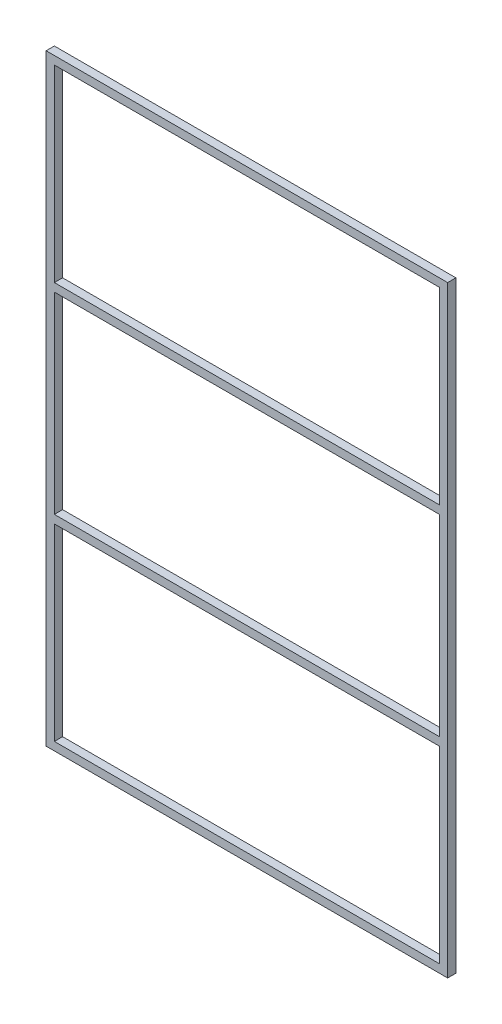
ISO-10303-21;
HEADER;
FILE_DESCRIPTION(('STEP AP214'),'2;1');
FILE_NAME('part.step','',(''),(''),'','','');
FILE_SCHEMA(('AUTOMOTIVE_DESIGN { 1 0 10303 214 1 1 1 1 }'));
ENDSEC;
DATA;
#1=APPLICATION_CONTEXT('core data for automotive mechanical design processes');
#2=APPLICATION_PROTOCOL_DEFINITION('international standard','automotive_design',2000,#1);
#3=PRODUCT_CONTEXT('',#1,'mechanical');
#4=PRODUCT('Part','Part','',(#3));
#5=PRODUCT_RELATED_PRODUCT_CATEGORY('part','',(#4));
#6=PRODUCT_DEFINITION_FORMATION('','',#4);
#7=PRODUCT_DEFINITION_CONTEXT('part definition',#1,'design');
#8=PRODUCT_DEFINITION('design','',#6,#7);
#9=PRODUCT_DEFINITION_SHAPE('','',#8);
#10=(LENGTH_UNIT() NAMED_UNIT(*) SI_UNIT(.MILLI.,.METRE.));
#11=(NAMED_UNIT(*) PLANE_ANGLE_UNIT() SI_UNIT($,.RADIAN.));
#12=(NAMED_UNIT(*) SI_UNIT($,.STERADIAN.) SOLID_ANGLE_UNIT());
#13=UNCERTAINTY_MEASURE_WITH_UNIT(LENGTH_MEASURE(1.E-05),#10,'distance_accuracy_value','');
#14=(GEOMETRIC_REPRESENTATION_CONTEXT(3) GLOBAL_UNCERTAINTY_ASSIGNED_CONTEXT((#13)) GLOBAL_UNIT_ASSIGNED_CONTEXT((#10,
#11,#12)) REPRESENTATION_CONTEXT('',''));
#15=CARTESIAN_POINT('',(0.,0.,0.));
#16=DIRECTION('',(0.,0.,1.));
#17=DIRECTION('',(1.,0.,0.));
#18=AXIS2_PLACEMENT_3D('',#15,#16,#17);
#19=CARTESIAN_POINT('',(0.,0.,50.));
#20=DIRECTION('',(0.,0.,1.));
#21=DIRECTION('',(1.,0.,0.));
#22=AXIS2_PLACEMENT_3D('',#19,#20,#21);
#23=PLANE('',#22);
#24=DIRECTION('',(0.,-1.,0.));
#25=VECTOR('',#24,1.);
#26=CARTESIAN_POINT('',(-1447.83132530121,1201.6265060241,50.));
#27=LINE('',#26,#25);
#28=CARTESIAN_POINT('',(-1447.83132530121,1201.6265060241,50.));
#29=VERTEX_POINT('',#28);
#30=CARTESIAN_POINT('',(-1447.8313253012,-2458.3734939759,50.));
#31=VERTEX_POINT('',#30);
#32=EDGE_CURVE('E293',#29,#31,#27,.T.);
#33=ORIENTED_EDGE('',*,*,#32,.T.);
#34=DIRECTION('',(1.,0.,0.));
#35=VECTOR('',#34,1.);
#36=CARTESIAN_POINT('',(-1447.8313253012,-2458.3734939759,50.));
#37=LINE('',#36,#35);
#38=CARTESIAN_POINT('',(992.168674698795,-2458.3734939759,50.));
#39=VERTEX_POINT('',#38);
#40=EDGE_CURVE('E297',#31,#39,#37,.T.);
#41=ORIENTED_EDGE('',*,*,#40,.T.);
#42=DIRECTION('',(0.,1.,0.));
#43=VECTOR('',#42,1.);
#44=CARTESIAN_POINT('',(992.168674698795,1201.6265060241,50.));
#45=LINE('',#44,#43);
#46=CARTESIAN_POINT('',(992.168674698795,1201.6265060241,50.));
#47=VERTEX_POINT('',#46);
#48=EDGE_CURVE('E301',#39,#47,#45,.T.);
#49=ORIENTED_EDGE('',*,*,#48,.T.);
#50=DIRECTION('',(-1.,0.,0.));
#51=VECTOR('',#50,1.);
#52=CARTESIAN_POINT('',(-1447.83132530121,1201.6265060241,50.));
#53=LINE('',#52,#51);
#54=EDGE_CURVE('E304',#47,#29,#53,.T.);
#55=ORIENTED_EDGE('',*,*,#54,.T.);
#56=EDGE_LOOP('',(#33,#41,#49,#55));
#57=FACE_BOUND('',#56,.T.);
#58=DIRECTION('',(1.,0.,0.));
#59=VECTOR('',#58,1.);
#60=CARTESIAN_POINT('',(-1397.83132530121,6.62650602409631,50.));
#61=LINE('',#60,#59);
#62=CARTESIAN_POINT('',(-1397.83132530121,6.62650602409631,50.));
#63=VERTEX_POINT('',#62);
#64=CARTESIAN_POINT('',(942.168674698795,6.62650602409642,50.));
#65=VERTEX_POINT('',#64);
#66=EDGE_CURVE('E253',#63,#65,#61,.T.);
#67=ORIENTED_EDGE('',*,*,#66,.F.);
#68=DIRECTION('',(0.,-1.,0.));
#69=VECTOR('',#68,1.);
#70=CARTESIAN_POINT('',(-1397.83132530121,6.62650602409631,50.));
#71=LINE('',#70,#69);
#72=CARTESIAN_POINT('',(-1397.83132530121,1151.6265060241,50.));
#73=VERTEX_POINT('',#72);
#74=EDGE_CURVE('E250',#73,#63,#71,.T.);
#75=ORIENTED_EDGE('',*,*,#74,.F.);
#76=DIRECTION('',(-1.,0.,0.));
#77=VECTOR('',#76,1.);
#78=CARTESIAN_POINT('',(-1397.83132530121,1151.6265060241,50.));
#79=LINE('',#78,#77);
#80=CARTESIAN_POINT('',(942.168674698794,1151.6265060241,50.));
#81=VERTEX_POINT('',#80);
#82=EDGE_CURVE('E261',#81,#73,#79,.T.);
#83=ORIENTED_EDGE('',*,*,#82,.F.);
#84=DIRECTION('',(0.,1.,0.));
#85=VECTOR('',#84,1.);
#86=CARTESIAN_POINT('',(942.168674698795,6.62650602409642,50.));
#87=LINE('',#86,#85);
#88=EDGE_CURVE('E257',#65,#81,#87,.T.);
#89=ORIENTED_EDGE('',*,*,#88,.F.);
#90=EDGE_LOOP('',(#67,#75,#83,#89));
#91=FACE_BOUND('',#90,.T.);
#92=DIRECTION('',(1.,0.,0.));
#93=VECTOR('',#92,1.);
#94=CARTESIAN_POINT('',(-1397.83132530121,-2408.3734939759,50.));
#95=LINE('',#94,#93);
#96=CARTESIAN_POINT('',(-1397.83132530121,-2408.3734939759,50.));
#97=VERTEX_POINT('',#96);
#98=CARTESIAN_POINT('',(942.168674698795,-2408.3734939759,50.));
#99=VERTEX_POINT('',#98);
#100=EDGE_CURVE('E210',#97,#99,#95,.T.);
#101=ORIENTED_EDGE('',*,*,#100,.F.);
#102=DIRECTION('',(0.,-1.,0.));
#103=VECTOR('',#102,1.);
#104=CARTESIAN_POINT('',(-1397.83132530121,-1263.3734939759,50.));
#105=LINE('',#104,#103);
#106=CARTESIAN_POINT('',(-1397.83132530121,-1263.3734939759,50.));
#107=VERTEX_POINT('',#106);
#108=EDGE_CURVE('E207',#107,#97,#105,.T.);
#109=ORIENTED_EDGE('',*,*,#108,.F.);
#110=DIRECTION('',(-1.,0.,0.));
#111=VECTOR('',#110,1.);
#112=CARTESIAN_POINT('',(-1397.83132530121,-1263.3734939759,50.));
#113=LINE('',#112,#111);
#114=CARTESIAN_POINT('',(942.168674698795,-1263.3734939759,50.));
#115=VERTEX_POINT('',#114);
#116=EDGE_CURVE('E218',#115,#107,#113,.T.);
#117=ORIENTED_EDGE('',*,*,#116,.F.);
#118=DIRECTION('',(0.,1.,0.));
#119=VECTOR('',#118,1.);
#120=CARTESIAN_POINT('',(942.168674698795,-1263.3734939759,50.));
#121=LINE('',#120,#119);
#122=EDGE_CURVE('E214',#99,#115,#121,.T.);
#123=ORIENTED_EDGE('',*,*,#122,.F.);
#124=EDGE_LOOP('',(#101,#109,#117,#123));
#125=FACE_BOUND('',#124,.T.);
#126=DIRECTION('',(1.,0.,0.));
#127=VECTOR('',#126,1.);
#128=CARTESIAN_POINT('',(-1397.83132530121,-1213.3734939759,50.));
#129=LINE('',#128,#127);
#130=CARTESIAN_POINT('',(-1397.83132530121,-1213.3734939759,50.));
#131=VERTEX_POINT('',#130);
#132=CARTESIAN_POINT('',(942.168674698795,-1213.3734939759,50.));
#133=VERTEX_POINT('',#132);
#134=EDGE_CURVE('E168',#131,#133,#129,.T.);
#135=ORIENTED_EDGE('',*,*,#134,.F.);
#136=DIRECTION('',(0.,-1.,0.));
#137=VECTOR('',#136,1.);
#138=CARTESIAN_POINT('',(-1397.83132530121,-43.3734939759036,50.));
#139=LINE('',#138,#137);
#140=CARTESIAN_POINT('',(-1397.83132530121,-43.3734939759036,50.));
#141=VERTEX_POINT('',#140);
#142=EDGE_CURVE('E159',#141,#131,#139,.T.);
#143=ORIENTED_EDGE('',*,*,#142,.F.);
#144=DIRECTION('',(-1.,0.,0.));
#145=VECTOR('',#144,1.);
#146=CARTESIAN_POINT('',(-1397.83132530121,-43.3734939759036,50.));
#147=LINE('',#146,#145);
#148=CARTESIAN_POINT('',(942.168674698795,-43.3734939759036,50.));
#149=VERTEX_POINT('',#148);
#150=EDGE_CURVE('E185',#149,#141,#147,.T.);
#151=ORIENTED_EDGE('',*,*,#150,.F.);
#152=DIRECTION('',(0.,1.,0.));
#153=VECTOR('',#152,1.);
#154=CARTESIAN_POINT('',(942.168674698795,-43.3734939759036,50.));
#155=LINE('',#154,#153);
#156=EDGE_CURVE('E181',#133,#149,#155,.T.);
#157=ORIENTED_EDGE('',*,*,#156,.F.);
#158=EDGE_LOOP('',(#135,#143,#151,#157));
#159=FACE_BOUND('',#158,.T.);
#160=ADVANCED_FACE('F45',(#57,#91,#125,#159),#23,.T.);
#161=CARTESIAN_POINT('',(0.,0.,0.));
#162=DIRECTION('',(0.,0.,1.));
#163=DIRECTION('',(1.,0.,0.));
#164=AXIS2_PLACEMENT_3D('',#161,#162,#163);
#165=PLANE('',#164);
#166=DIRECTION('',(0.,-1.,0.));
#167=VECTOR('',#166,1.);
#168=CARTESIAN_POINT('',(-1397.83132530121,-1263.3734939759,0.));
#169=LINE('',#168,#167);
#170=CARTESIAN_POINT('',(-1397.83132530121,-1263.3734939759,0.));
#171=VERTEX_POINT('',#170);
#172=CARTESIAN_POINT('',(-1397.83132530121,-2408.3734939759,0.));
#173=VERTEX_POINT('',#172);
#174=EDGE_CURVE('E177',#171,#173,#169,.T.);
#175=ORIENTED_EDGE('',*,*,#174,.T.);
#176=DIRECTION('',(1.,0.,0.));
#177=VECTOR('',#176,1.);
#178=CARTESIAN_POINT('',(-1397.83132530121,-2408.3734939759,0.));
#179=LINE('',#178,#177);
#180=CARTESIAN_POINT('',(942.168674698795,-2408.3734939759,0.));
#181=VERTEX_POINT('',#180);
#182=EDGE_CURVE('E225',#173,#181,#179,.T.);
#183=ORIENTED_EDGE('',*,*,#182,.T.);
#184=DIRECTION('',(0.,1.,0.));
#185=VECTOR('',#184,1.);
#186=CARTESIAN_POINT('',(942.168674698795,-1263.3734939759,0.));
#187=LINE('',#186,#185);
#188=CARTESIAN_POINT('',(942.168674698795,-1263.3734939759,0.));
#189=VERTEX_POINT('',#188);
#190=EDGE_CURVE('E229',#181,#189,#187,.T.);
#191=ORIENTED_EDGE('',*,*,#190,.T.);
#192=DIRECTION('',(-1.,0.,0.));
#193=VECTOR('',#192,1.);
#194=CARTESIAN_POINT('',(-1397.83132530121,-1263.3734939759,0.));
#195=LINE('',#194,#193);
#196=EDGE_CURVE('E211',#189,#171,#195,.T.);
#197=ORIENTED_EDGE('',*,*,#196,.T.);
#198=EDGE_LOOP('',(#175,#183,#191,#197));
#199=FACE_BOUND('',#198,.T.);
#200=DIRECTION('',(0.,-1.,0.));
#201=VECTOR('',#200,1.);
#202=CARTESIAN_POINT('',(-1447.83132530121,1201.6265060241,0.));
#203=LINE('',#202,#201);
#204=CARTESIAN_POINT('',(-1447.83132530121,1201.6265060241,0.));
#205=VERTEX_POINT('',#204);
#206=CARTESIAN_POINT('',(-1447.8313253012,-2458.3734939759,0.));
#207=VERTEX_POINT('',#206);
#208=EDGE_CURVE('E292',#205,#207,#203,.T.);
#209=ORIENTED_EDGE('',*,*,#208,.F.);
#210=DIRECTION('',(-1.,0.,0.));
#211=VECTOR('',#210,1.);
#212=CARTESIAN_POINT('',(-1447.83132530121,1201.6265060241,0.));
#213=LINE('',#212,#211);
#214=CARTESIAN_POINT('',(992.168674698795,1201.6265060241,0.));
#215=VERTEX_POINT('',#214);
#216=EDGE_CURVE('E298',#215,#205,#213,.T.);
#217=ORIENTED_EDGE('',*,*,#216,.F.);
#218=DIRECTION('',(0.,1.,0.));
#219=VECTOR('',#218,1.);
#220=CARTESIAN_POINT('',(992.168674698795,1201.6265060241,0.));
#221=LINE('',#220,#219);
#222=CARTESIAN_POINT('',(992.168674698795,-2458.3734939759,0.));
#223=VERTEX_POINT('',#222);
#224=EDGE_CURVE('E314',#223,#215,#221,.T.);
#225=ORIENTED_EDGE('',*,*,#224,.F.);
#226=DIRECTION('',(1.,0.,0.));
#227=VECTOR('',#226,1.);
#228=CARTESIAN_POINT('',(-1447.8313253012,-2458.3734939759,0.));
#229=LINE('',#228,#227);
#230=EDGE_CURVE('E311',#207,#223,#229,.T.);
#231=ORIENTED_EDGE('',*,*,#230,.F.);
#232=EDGE_LOOP('',(#209,#217,#225,#231));
#233=FACE_BOUND('',#232,.T.);
#234=DIRECTION('',(0.,-1.,0.));
#235=VECTOR('',#234,1.);
#236=CARTESIAN_POINT('',(-1397.83132530121,6.62650602409631,0.));
#237=LINE('',#236,#235);
#238=CARTESIAN_POINT('',(-1397.83132530121,1151.6265060241,0.));
#239=VERTEX_POINT('',#238);
#240=CARTESIAN_POINT('',(-1397.83132530121,6.62650602409631,0.));
#241=VERTEX_POINT('',#240);
#242=EDGE_CURVE('E249',#239,#241,#237,.T.);
#243=ORIENTED_EDGE('',*,*,#242,.T.);
#244=DIRECTION('',(1.,0.,0.));
#245=VECTOR('',#244,1.);
#246=CARTESIAN_POINT('',(-1397.83132530121,6.62650602409631,0.));
#247=LINE('',#246,#245);
#248=CARTESIAN_POINT('',(942.168674698795,6.62650602409642,0.));
#249=VERTEX_POINT('',#248);
#250=EDGE_CURVE('E268',#241,#249,#247,.T.);
#251=ORIENTED_EDGE('',*,*,#250,.T.);
#252=DIRECTION('',(0.,1.,0.));
#253=VECTOR('',#252,1.);
#254=CARTESIAN_POINT('',(942.168674698795,6.62650602409642,0.));
#255=LINE('',#254,#253);
#256=CARTESIAN_POINT('',(942.168674698794,1151.6265060241,0.));
#257=VERTEX_POINT('',#256);
#258=EDGE_CURVE('E272',#249,#257,#255,.T.);
#259=ORIENTED_EDGE('',*,*,#258,.T.);
#260=DIRECTION('',(-1.,0.,0.));
#261=VECTOR('',#260,1.);
#262=CARTESIAN_POINT('',(-1397.83132530121,1151.6265060241,0.));
#263=LINE('',#262,#261);
#264=EDGE_CURVE('E254',#257,#239,#263,.T.);
#265=ORIENTED_EDGE('',*,*,#264,.T.);
#266=EDGE_LOOP('',(#243,#251,#259,#265));
#267=FACE_BOUND('',#266,.T.);
#268=DIRECTION('',(0.,-1.,0.));
#269=VECTOR('',#268,1.);
#270=CARTESIAN_POINT('',(-1397.83132530121,-43.3734939759036,0.));
#271=LINE('',#270,#269);
#272=CARTESIAN_POINT('',(-1397.83132530121,-43.3734939759036,0.));
#273=VERTEX_POINT('',#272);
#274=CARTESIAN_POINT('',(-1397.83132530121,-1213.3734939759,0.));
#275=VERTEX_POINT('',#274);
#276=EDGE_CURVE('E69',#273,#275,#271,.T.);
#277=ORIENTED_EDGE('',*,*,#276,.T.);
#278=DIRECTION('',(1.,0.,0.));
#279=VECTOR('',#278,1.);
#280=CARTESIAN_POINT('',(-1397.83132530121,-1213.3734939759,0.));
#281=LINE('',#280,#279);
#282=CARTESIAN_POINT('',(942.168674698795,-1213.3734939759,0.));
#283=VERTEX_POINT('',#282);
#284=EDGE_CURVE('E175',#275,#283,#281,.T.);
#285=ORIENTED_EDGE('',*,*,#284,.T.);
#286=DIRECTION('',(0.,1.,0.));
#287=VECTOR('',#286,1.);
#288=CARTESIAN_POINT('',(942.168674698795,-43.3734939759036,0.));
#289=LINE('',#288,#287);
#290=CARTESIAN_POINT('',(942.168674698795,-43.3734939759036,0.));
#291=VERTEX_POINT('',#290);
#292=EDGE_CURVE('E194',#283,#291,#289,.T.);
#293=ORIENTED_EDGE('',*,*,#292,.T.);
#294=DIRECTION('',(-1.,0.,0.));
#295=VECTOR('',#294,1.);
#296=CARTESIAN_POINT('',(-1397.83132530121,-43.3734939759036,0.));
#297=LINE('',#296,#295);
#298=EDGE_CURVE('E169',#291,#273,#297,.T.);
#299=ORIENTED_EDGE('',*,*,#298,.T.);
#300=EDGE_LOOP('',(#277,#285,#293,#299));
#301=FACE_BOUND('',#300,.T.);
#302=ADVANCED_FACE('F337',(#199,#233,#267,#301),#165,.F.);
#303=CARTESIAN_POINT('',(-1447.83132530121,1201.6265060241,50.));
#304=DIRECTION('',(1.,0.,0.));
#305=DIRECTION('',(0.,1.,0.));
#306=AXIS2_PLACEMENT_3D('',#303,#304,#305);
#307=PLANE('',#306);
#308=ORIENTED_EDGE('',*,*,#208,.T.);
#309=DIRECTION('',(0.,0.,-1.));
#310=VECTOR('',#309,1.);
#311=CARTESIAN_POINT('',(-1447.8313253012,-2458.3734939759,50.));
#312=LINE('',#311,#310);
#313=EDGE_CURVE('E11',#31,#207,#312,.T.);
#314=ORIENTED_EDGE('',*,*,#313,.F.);
#315=ORIENTED_EDGE('',*,*,#32,.F.);
#316=DIRECTION('',(0.,0.,-1.));
#317=VECTOR('',#316,1.);
#318=CARTESIAN_POINT('',(-1447.83132530121,1201.6265060241,50.));
#319=LINE('',#318,#317);
#320=EDGE_CURVE('E307',#29,#205,#319,.T.);
#321=ORIENTED_EDGE('',*,*,#320,.T.);
#322=EDGE_LOOP('',(#308,#314,#315,#321));
#323=FACE_BOUND('',#322,.T.);
#324=ADVANCED_FACE('F47',(#323),#307,.F.);
#325=CARTESIAN_POINT('',(-1447.8313253012,-2458.3734939759,50.));
#326=DIRECTION('',(0.,1.,0.));
#327=DIRECTION('',(0.,0.,1.));
#328=AXIS2_PLACEMENT_3D('',#325,#326,#327);
#329=PLANE('',#328);
#330=ORIENTED_EDGE('',*,*,#230,.T.);
#331=DIRECTION('',(0.,0.,-1.));
#332=VECTOR('',#331,1.);
#333=CARTESIAN_POINT('',(992.168674698795,-2458.3734939759,50.));
#334=LINE('',#333,#332);
#335=EDGE_CURVE('E54',#39,#223,#334,.T.);
#336=ORIENTED_EDGE('',*,*,#335,.F.);
#337=ORIENTED_EDGE('',*,*,#40,.F.);
#338=ORIENTED_EDGE('',*,*,#313,.T.);
#339=EDGE_LOOP('',(#330,#336,#337,#338));
#340=FACE_BOUND('',#339,.T.);
#341=ADVANCED_FACE('F348',(#340),#329,.F.);
#342=CARTESIAN_POINT('',(992.168674698795,1201.6265060241,50.));
#343=DIRECTION('',(-1.,0.,0.));
#344=DIRECTION('',(0.,-1.,0.));
#345=AXIS2_PLACEMENT_3D('',#342,#343,#344);
#346=PLANE('',#345);
#347=ORIENTED_EDGE('',*,*,#224,.T.);
#348=DIRECTION('',(0.,0.,-1.));
#349=VECTOR('',#348,1.);
#350=CARTESIAN_POINT('',(992.168674698795,1201.6265060241,50.));
#351=LINE('',#350,#349);
#352=EDGE_CURVE('E322',#47,#215,#351,.T.);
#353=ORIENTED_EDGE('',*,*,#352,.F.);
#354=ORIENTED_EDGE('',*,*,#48,.F.);
#355=ORIENTED_EDGE('',*,*,#335,.T.);
#356=EDGE_LOOP('',(#347,#353,#354,#355));
#357=FACE_BOUND('',#356,.T.);
#358=ADVANCED_FACE('F331',(#357),#346,.F.);
#359=CARTESIAN_POINT('',(-1447.83132530121,1201.6265060241,50.));
#360=DIRECTION('',(0.,-1.,0.));
#361=DIRECTION('',(0.,0.,-1.));
#362=AXIS2_PLACEMENT_3D('',#359,#360,#361);
#363=PLANE('',#362);
#364=ORIENTED_EDGE('',*,*,#216,.T.);
#365=ORIENTED_EDGE('',*,*,#320,.F.);
#366=ORIENTED_EDGE('',*,*,#54,.F.);
#367=ORIENTED_EDGE('',*,*,#352,.T.);
#368=EDGE_LOOP('',(#364,#365,#366,#367));
#369=FACE_BOUND('',#368,.T.);
#370=ADVANCED_FACE('F341',(#369),#363,.F.);
#371=CARTESIAN_POINT('',(-1397.83132530121,6.62650602409631,50.));
#372=DIRECTION('',(1.,0.,0.));
#373=DIRECTION('',(0.,0.,-1.));
#374=AXIS2_PLACEMENT_3D('',#371,#372,#373);
#375=PLANE('',#374);
#376=ORIENTED_EDGE('',*,*,#242,.F.);
#377=DIRECTION('',(0.,0.,-1.));
#378=VECTOR('',#377,1.);
#379=CARTESIAN_POINT('',(-1397.83132530121,1151.6265060241,50.));
#380=LINE('',#379,#378);
#381=EDGE_CURVE('E264',#73,#239,#380,.T.);
#382=ORIENTED_EDGE('',*,*,#381,.F.);
#383=ORIENTED_EDGE('',*,*,#74,.T.);
#384=DIRECTION('',(0.,0.,-1.));
#385=VECTOR('',#384,1.);
#386=CARTESIAN_POINT('',(-1397.83132530121,6.62650602409631,50.));
#387=LINE('',#386,#385);
#388=EDGE_CURVE('E288',#63,#241,#387,.T.);
#389=ORIENTED_EDGE('',*,*,#388,.T.);
#390=EDGE_LOOP('',(#376,#382,#383,#389));
#391=FACE_BOUND('',#390,.T.);
#392=ADVANCED_FACE('F363',(#391),#375,.T.);
#393=CARTESIAN_POINT('',(-1397.83132530121,6.62650602409631,50.));
#394=DIRECTION('',(0.,1.,0.));
#395=DIRECTION('',(-1.,0.,0.));
#396=AXIS2_PLACEMENT_3D('',#393,#394,#395);
#397=PLANE('',#396);
#398=ORIENTED_EDGE('',*,*,#250,.F.);
#399=ORIENTED_EDGE('',*,*,#388,.F.);
#400=ORIENTED_EDGE('',*,*,#66,.T.);
#401=DIRECTION('',(0.,0.,-1.));
#402=VECTOR('',#401,1.);
#403=CARTESIAN_POINT('',(942.168674698795,6.62650602409642,50.));
#404=LINE('',#403,#402);
#405=EDGE_CURVE('E285',#65,#249,#404,.T.);
#406=ORIENTED_EDGE('',*,*,#405,.T.);
#407=EDGE_LOOP('',(#398,#399,#400,#406));
#408=FACE_BOUND('',#407,.T.);
#409=ADVANCED_FACE('F370',(#408),#397,.T.);
#410=CARTESIAN_POINT('',(942.168674698795,6.62650602409642,50.));
#411=DIRECTION('',(-1.,0.,0.));
#412=DIRECTION('',(0.,-1.,0.));
#413=AXIS2_PLACEMENT_3D('',#410,#411,#412);
#414=PLANE('',#413);
#415=ORIENTED_EDGE('',*,*,#258,.F.);
#416=ORIENTED_EDGE('',*,*,#405,.F.);
#417=ORIENTED_EDGE('',*,*,#88,.T.);
#418=DIRECTION('',(0.,0.,-1.));
#419=VECTOR('',#418,1.);
#420=CARTESIAN_POINT('',(942.168674698794,1151.6265060241,50.));
#421=LINE('',#420,#419);
#422=EDGE_CURVE('E282',#81,#257,#421,.T.);
#423=ORIENTED_EDGE('',*,*,#422,.T.);
#424=EDGE_LOOP('',(#415,#416,#417,#423));
#425=FACE_BOUND('',#424,.T.);
#426=ADVANCED_FACE('F375',(#425),#414,.T.);
#427=CARTESIAN_POINT('',(-1397.83132530121,1151.6265060241,50.));
#428=DIRECTION('',(0.,-1.,0.));
#429=DIRECTION('',(0.,0.,-1.));
#430=AXIS2_PLACEMENT_3D('',#427,#428,#429);
#431=PLANE('',#430);
#432=ORIENTED_EDGE('',*,*,#264,.F.);
#433=ORIENTED_EDGE('',*,*,#422,.F.);
#434=ORIENTED_EDGE('',*,*,#82,.T.);
#435=ORIENTED_EDGE('',*,*,#381,.T.);
#436=EDGE_LOOP('',(#432,#433,#434,#435));
#437=FACE_BOUND('',#436,.T.);
#438=ADVANCED_FACE('F382',(#437),#431,.T.);
#439=CARTESIAN_POINT('',(-1397.83132530121,-1263.3734939759,50.));
#440=DIRECTION('',(1.,0.,0.));
#441=DIRECTION('',(0.,0.,-1.));
#442=AXIS2_PLACEMENT_3D('',#439,#440,#441);
#443=PLANE('',#442);
#444=ORIENTED_EDGE('',*,*,#174,.F.);
#445=DIRECTION('',(0.,0.,-1.));
#446=VECTOR('',#445,1.);
#447=CARTESIAN_POINT('',(-1397.83132530121,-1263.3734939759,50.));
#448=LINE('',#447,#446);
#449=EDGE_CURVE('E221',#107,#171,#448,.T.);
#450=ORIENTED_EDGE('',*,*,#449,.F.);
#451=ORIENTED_EDGE('',*,*,#108,.T.);
#452=DIRECTION('',(0.,0.,-1.));
#453=VECTOR('',#452,1.);
#454=CARTESIAN_POINT('',(-1397.83132530121,-2408.3734939759,50.));
#455=LINE('',#454,#453);
#456=EDGE_CURVE('E245',#97,#173,#455,.T.);
#457=ORIENTED_EDGE('',*,*,#456,.T.);
#458=EDGE_LOOP('',(#444,#450,#451,#457));
#459=FACE_BOUND('',#458,.T.);
#460=ADVANCED_FACE('F404',(#459),#443,.T.);
#461=CARTESIAN_POINT('',(-1397.83132530121,-2408.3734939759,50.));
#462=DIRECTION('',(0.,1.,0.));
#463=DIRECTION('',(0.,0.,1.));
#464=AXIS2_PLACEMENT_3D('',#461,#462,#463);
#465=PLANE('',#464);
#466=ORIENTED_EDGE('',*,*,#182,.F.);
#467=ORIENTED_EDGE('',*,*,#456,.F.);
#468=ORIENTED_EDGE('',*,*,#100,.T.);
#469=DIRECTION('',(0.,0.,-1.));
#470=VECTOR('',#469,1.);
#471=CARTESIAN_POINT('',(942.168674698795,-2408.3734939759,50.));
#472=LINE('',#471,#470);
#473=EDGE_CURVE('E242',#99,#181,#472,.T.);
#474=ORIENTED_EDGE('',*,*,#473,.T.);
#475=EDGE_LOOP('',(#466,#467,#468,#474));
#476=FACE_BOUND('',#475,.T.);
#477=ADVANCED_FACE('F398',(#476),#465,.T.);
#478=CARTESIAN_POINT('',(942.168674698795,-1263.3734939759,50.));
#479=DIRECTION('',(-1.,0.,0.));
#480=DIRECTION('',(0.,-1.,0.));
#481=AXIS2_PLACEMENT_3D('',#478,#479,#480);
#482=PLANE('',#481);
#483=ORIENTED_EDGE('',*,*,#190,.F.);
#484=ORIENTED_EDGE('',*,*,#473,.F.);
#485=ORIENTED_EDGE('',*,*,#122,.T.);
#486=DIRECTION('',(0.,0.,-1.));
#487=VECTOR('',#486,1.);
#488=CARTESIAN_POINT('',(942.168674698795,-1263.3734939759,50.));
#489=LINE('',#488,#487);
#490=EDGE_CURVE('E239',#115,#189,#489,.T.);
#491=ORIENTED_EDGE('',*,*,#490,.T.);
#492=EDGE_LOOP('',(#483,#484,#485,#491));
#493=FACE_BOUND('',#492,.T.);
#494=ADVANCED_FACE('F401',(#493),#482,.T.);
#495=CARTESIAN_POINT('',(-1397.83132530121,-1263.3734939759,50.));
#496=DIRECTION('',(0.,-1.,0.));
#497=DIRECTION('',(1.,0.,0.));
#498=AXIS2_PLACEMENT_3D('',#495,#496,#497);
#499=PLANE('',#498);
#500=ORIENTED_EDGE('',*,*,#196,.F.);
#501=ORIENTED_EDGE('',*,*,#490,.F.);
#502=ORIENTED_EDGE('',*,*,#116,.T.);
#503=ORIENTED_EDGE('',*,*,#449,.T.);
#504=EDGE_LOOP('',(#500,#501,#502,#503));
#505=FACE_BOUND('',#504,.T.);
#506=ADVANCED_FACE('F407',(#505),#499,.T.);
#507=CARTESIAN_POINT('',(-1397.83132530121,-43.3734939759036,50.));
#508=DIRECTION('',(1.,0.,0.));
#509=DIRECTION('',(0.,0.,-1.));
#510=AXIS2_PLACEMENT_3D('',#507,#508,#509);
#511=PLANE('',#510);
#512=ORIENTED_EDGE('',*,*,#276,.F.);
#513=DIRECTION('',(0.,0.,-1.));
#514=VECTOR('',#513,1.);
#515=CARTESIAN_POINT('',(-1397.83132530121,-43.3734939759036,50.));
#516=LINE('',#515,#514);
#517=EDGE_CURVE('E163',#141,#273,#516,.T.);
#518=ORIENTED_EDGE('',*,*,#517,.F.);
#519=ORIENTED_EDGE('',*,*,#142,.T.);
#520=DIRECTION('',(0.,0.,-1.));
#521=VECTOR('',#520,1.);
#522=CARTESIAN_POINT('',(-1397.83132530121,-1213.3734939759,50.));
#523=LINE('',#522,#521);
#524=EDGE_CURVE('E162',#131,#275,#523,.T.);
#525=ORIENTED_EDGE('',*,*,#524,.T.);
#526=EDGE_LOOP('',(#512,#518,#519,#525));
#527=FACE_BOUND('',#526,.T.);
#528=ADVANCED_FACE('F161',(#527),#511,.T.);
#529=CARTESIAN_POINT('',(-1397.83132530121,-1213.3734939759,50.));
#530=DIRECTION('',(0.,1.,0.));
#531=DIRECTION('',(0.,0.,1.));
#532=AXIS2_PLACEMENT_3D('',#529,#530,#531);
#533=PLANE('',#532);
#534=ORIENTED_EDGE('',*,*,#284,.F.);
#535=ORIENTED_EDGE('',*,*,#524,.F.);
#536=ORIENTED_EDGE('',*,*,#134,.T.);
#537=DIRECTION('',(0.,0.,-1.));
#538=VECTOR('',#537,1.);
#539=CARTESIAN_POINT('',(942.168674698795,-1213.3734939759,50.));
#540=LINE('',#539,#538);
#541=EDGE_CURVE('E178',#133,#283,#540,.T.);
#542=ORIENTED_EDGE('',*,*,#541,.T.);
#543=EDGE_LOOP('',(#534,#535,#536,#542));
#544=FACE_BOUND('',#543,.T.);
#545=ADVANCED_FACE('F172',(#544),#533,.T.);
#546=CARTESIAN_POINT('',(942.168674698795,-43.3734939759036,50.));
#547=DIRECTION('',(-1.,0.,0.));
#548=DIRECTION('',(0.,0.,1.));
#549=AXIS2_PLACEMENT_3D('',#546,#547,#548);
#550=PLANE('',#549);
#551=ORIENTED_EDGE('',*,*,#292,.F.);
#552=ORIENTED_EDGE('',*,*,#541,.F.);
#553=ORIENTED_EDGE('',*,*,#156,.T.);
#554=DIRECTION('',(0.,0.,-1.));
#555=VECTOR('',#554,1.);
#556=CARTESIAN_POINT('',(942.168674698795,-43.3734939759036,50.));
#557=LINE('',#556,#555);
#558=EDGE_CURVE('E61',#149,#291,#557,.T.);
#559=ORIENTED_EDGE('',*,*,#558,.T.);
#560=EDGE_LOOP('',(#551,#552,#553,#559));
#561=FACE_BOUND('',#560,.T.);
#562=ADVANCED_FACE('F467',(#561),#550,.T.);
#563=CARTESIAN_POINT('',(-1397.83132530121,-43.3734939759036,50.));
#564=DIRECTION('',(0.,-1.,0.));
#565=DIRECTION('',(0.,0.,-1.));
#566=AXIS2_PLACEMENT_3D('',#563,#564,#565);
#567=PLANE('',#566);
#568=ORIENTED_EDGE('',*,*,#298,.F.);
#569=ORIENTED_EDGE('',*,*,#558,.F.);
#570=ORIENTED_EDGE('',*,*,#150,.T.);
#571=ORIENTED_EDGE('',*,*,#517,.T.);
#572=EDGE_LOOP('',(#568,#569,#570,#571));
#573=FACE_BOUND('',#572,.T.);
#574=ADVANCED_FACE('F476',(#573),#567,.T.);
#575=CLOSED_SHELL('',(#160,#302,#324,#341,#358,#370,#392,#409,#426,#438,#460,#477,#494,#506,
#528,#545,#562,#574));
#576=MANIFOLD_SOLID_BREP('B2',#575);
#577=ADVANCED_BREP_SHAPE_REPRESENTATION('',(#18,#576),#14);
#578=SHAPE_DEFINITION_REPRESENTATION(#9,#577);
ENDSEC;
END-ISO-10303-21;
